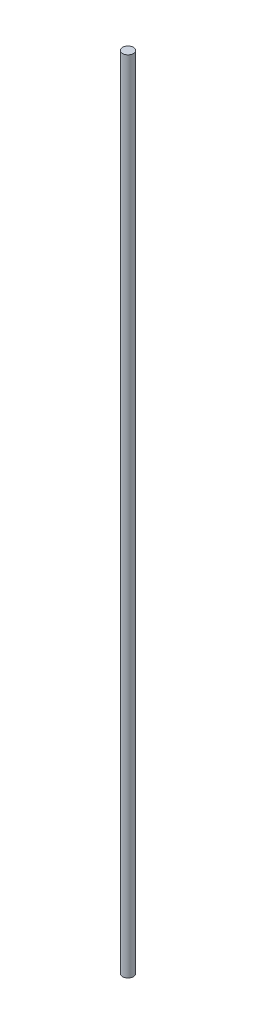
ISO-10303-21;
HEADER;
FILE_DESCRIPTION(('STEP AP214'),'2;1');
FILE_NAME('part.step','',(''),(''),'','','');
FILE_SCHEMA(('AUTOMOTIVE_DESIGN { 1 0 10303 214 1 1 1 1 }'));
ENDSEC;
DATA;
#1=APPLICATION_CONTEXT('core data for automotive mechanical design processes');
#2=APPLICATION_PROTOCOL_DEFINITION('international standard','automotive_design',2000,#1);
#3=PRODUCT_CONTEXT('',#1,'mechanical');
#4=PRODUCT('Part','Part','',(#3));
#5=PRODUCT_RELATED_PRODUCT_CATEGORY('part','',(#4));
#6=PRODUCT_DEFINITION_FORMATION('','',#4);
#7=PRODUCT_DEFINITION_CONTEXT('part definition',#1,'design');
#8=PRODUCT_DEFINITION('design','',#6,#7);
#9=PRODUCT_DEFINITION_SHAPE('','',#8);
#10=(LENGTH_UNIT() NAMED_UNIT(*) SI_UNIT(.MILLI.,.METRE.));
#11=(NAMED_UNIT(*) PLANE_ANGLE_UNIT() SI_UNIT($,.RADIAN.));
#12=(NAMED_UNIT(*) SI_UNIT($,.STERADIAN.) SOLID_ANGLE_UNIT());
#13=UNCERTAINTY_MEASURE_WITH_UNIT(LENGTH_MEASURE(1.E-05),#10,'distance_accuracy_value','');
#14=(GEOMETRIC_REPRESENTATION_CONTEXT(3) GLOBAL_UNCERTAINTY_ASSIGNED_CONTEXT((#13)) GLOBAL_UNIT_ASSIGNED_CONTEXT((#10,
#11,#12)) REPRESENTATION_CONTEXT('',''));
#15=CARTESIAN_POINT('',(0.,0.,0.));
#16=DIRECTION('',(0.,0.,1.));
#17=DIRECTION('',(1.,0.,0.));
#18=AXIS2_PLACEMENT_3D('',#15,#16,#17);
#19=CARTESIAN_POINT('',(0.,935.5,0.));
#20=DIRECTION('',(0.,-1.,0.));
#21=DIRECTION('',(0.,0.,-1.));
#22=AXIS2_PLACEMENT_3D('',#19,#20,#21);
#23=CYLINDRICAL_SURFACE('',#22,6.35);
#24=CARTESIAN_POINT('',(0.,935.5,0.));
#25=DIRECTION('',(0.,1.,0.));
#26=DIRECTION('',(0.,0.,1.));
#27=AXIS2_PLACEMENT_3D('',#24,#25,#26);
#28=CIRCLE('',#27,6.35);
#29=CARTESIAN_POINT('',(0.,935.5,-6.35));
#30=VERTEX_POINT('',#29);
#31=EDGE_CURVE('E10',#30,#30,#28,.T.);
#32=CARTESIAN_POINT('',(0.,0.,0.));
#33=DIRECTION('',(0.,1.,0.));
#34=DIRECTION('',(0.,0.,1.));
#35=AXIS2_PLACEMENT_3D('',#32,#33,#34);
#36=CIRCLE('',#35,6.35);
#37=CARTESIAN_POINT('',(0.,-1.11022302462516E-13,-6.35));
#38=VERTEX_POINT('',#37);
#39=EDGE_CURVE('E33',#38,#38,#36,.T.);
#40=CARTESIAN_POINT('',(0.,935.5,-6.35));
#41=CARTESIAN_POINT('',(0.,925.755208333333,-6.35));
#42=CARTESIAN_POINT('',(0.,916.010416666667,-6.35));
#43=CARTESIAN_POINT('',(0.,896.520833333333,-6.35));
#44=CARTESIAN_POINT('',(0.,886.776041666667,-6.35));
#45=CARTESIAN_POINT('',(0.,867.286458333333,-6.35));
#46=CARTESIAN_POINT('',(0.,857.541666666667,-6.35));
#47=CARTESIAN_POINT('',(0.,838.052083333333,-6.35));
#48=CARTESIAN_POINT('',(0.,828.307291666667,-6.35));
#49=CARTESIAN_POINT('',(0.,808.817708333333,-6.35));
#50=CARTESIAN_POINT('',(0.,799.072916666667,-6.35));
#51=CARTESIAN_POINT('',(0.,779.583333333333,-6.35));
#52=CARTESIAN_POINT('',(0.,769.838541666667,-6.35));
#53=CARTESIAN_POINT('',(0.,750.348958333333,-6.35));
#54=CARTESIAN_POINT('',(0.,740.604166666667,-6.35));
#55=CARTESIAN_POINT('',(0.,721.114583333333,-6.35));
#56=CARTESIAN_POINT('',(0.,711.369791666667,-6.35));
#57=CARTESIAN_POINT('',(0.,691.880208333333,-6.35));
#58=CARTESIAN_POINT('',(0.,682.135416666667,-6.35));
#59=CARTESIAN_POINT('',(0.,662.645833333333,-6.35));
#60=CARTESIAN_POINT('',(0.,652.901041666667,-6.35));
#61=CARTESIAN_POINT('',(0.,633.411458333333,-6.35));
#62=CARTESIAN_POINT('',(0.,623.666666666667,-6.35));
#63=CARTESIAN_POINT('',(0.,604.177083333333,-6.35));
#64=CARTESIAN_POINT('',(0.,594.432291666667,-6.35));
#65=CARTESIAN_POINT('',(0.,574.942708333333,-6.35));
#66=CARTESIAN_POINT('',(0.,565.197916666667,-6.35));
#67=CARTESIAN_POINT('',(0.,545.708333333333,-6.35));
#68=CARTESIAN_POINT('',(0.,535.963541666667,-6.35));
#69=CARTESIAN_POINT('',(0.,516.473958333333,-6.35));
#70=CARTESIAN_POINT('',(0.,506.729166666667,-6.35));
#71=CARTESIAN_POINT('',(0.,487.239583333333,-6.35));
#72=CARTESIAN_POINT('',(0.,477.494791666667,-6.35));
#73=CARTESIAN_POINT('',(0.,458.005208333333,-6.35));
#74=CARTESIAN_POINT('',(0.,448.260416666667,-6.35));
#75=CARTESIAN_POINT('',(0.,428.770833333333,-6.35));
#76=CARTESIAN_POINT('',(0.,419.026041666667,-6.35));
#77=CARTESIAN_POINT('',(0.,399.536458333333,-6.35));
#78=CARTESIAN_POINT('',(0.,389.791666666667,-6.35));
#79=CARTESIAN_POINT('',(0.,370.302083333333,-6.35));
#80=CARTESIAN_POINT('',(0.,360.557291666667,-6.35));
#81=CARTESIAN_POINT('',(0.,341.067708333333,-6.35));
#82=CARTESIAN_POINT('',(0.,331.322916666667,-6.35));
#83=CARTESIAN_POINT('',(0.,311.833333333333,-6.35));
#84=CARTESIAN_POINT('',(0.,302.088541666667,-6.35));
#85=CARTESIAN_POINT('',(0.,282.598958333333,-6.35));
#86=CARTESIAN_POINT('',(0.,272.854166666667,-6.35));
#87=CARTESIAN_POINT('',(0.,253.364583333333,-6.35));
#88=CARTESIAN_POINT('',(0.,243.619791666667,-6.35));
#89=CARTESIAN_POINT('',(0.,224.130208333333,-6.35));
#90=CARTESIAN_POINT('',(0.,214.385416666667,-6.35));
#91=CARTESIAN_POINT('',(0.,194.895833333333,-6.35));
#92=CARTESIAN_POINT('',(0.,185.151041666667,-6.35));
#93=CARTESIAN_POINT('',(0.,165.661458333333,-6.35));
#94=CARTESIAN_POINT('',(0.,155.916666666667,-6.35));
#95=CARTESIAN_POINT('',(0.,136.427083333333,-6.35));
#96=CARTESIAN_POINT('',(0.,126.682291666667,-6.35));
#97=CARTESIAN_POINT('',(0.,107.192708333333,-6.35));
#98=CARTESIAN_POINT('',(0.,97.4479166666666,-6.35));
#99=CARTESIAN_POINT('',(0.,77.9583333333332,-6.35));
#100=CARTESIAN_POINT('',(0.,68.2135416666665,-6.35));
#101=CARTESIAN_POINT('',(0.,48.7239583333332,-6.35));
#102=CARTESIAN_POINT('',(0.,38.9791666666666,-6.35));
#103=CARTESIAN_POINT('',(0.,19.4895833333332,-6.35));
#104=CARTESIAN_POINT('',(0.,9.74479166666657,-6.35));
#105=CARTESIAN_POINT('',(0.,-1.11022302462516E-13,-6.35));
#106=B_SPLINE_CURVE_WITH_KNOTS('',3,(#40,#41,#42,#43,#44,#45,#46,#47,#48,#49,#50,#51,#52,#53,
#54,#55,#56,#57,#58,#59,#60,#61,#62,#63,#64,#65,#66,#67,#68,#69,#70,#71,#72,#73,#74,#75,#76,#77,
#78,#79,#80,#81,#82,#83,#84,#85,#86,#87,#88,#89,#90,#91,#92,#93,#94,#95,#96,#97,#98,#99,#100,
#101,#102,#103,#104,#105),.UNSPECIFIED.,.F.,.F.,(4,2,2,2,2,2,2,2,2,2,2,2,2,2,2,2,2,2,2,2,2,2,2,
2,2,2,2,2,2,2,2,2,4),(0.,29.2343749999999,58.46875,87.7031249999999,116.9375,146.171875,
175.40625,204.640625,233.875,263.109375,292.34375,321.578125,350.8125,380.046875,409.28125,
438.515625,467.75,496.984375,526.21875,555.453125,584.6875,613.921875,643.15625,672.390625,
701.625,730.859375,760.09375,789.328125,818.5625,847.796875,877.03125,906.265625,935.5),.UNSPECIFIED.);
#107=EDGE_CURVE('BSEAM30',#30,#38,#106,.T.);
#108=ORIENTED_EDGE('',*,*,#31,.F.);
#109=ORIENTED_EDGE('',*,*,#39,.T.);
#110=ORIENTED_EDGE('',*,*,#107,.T.);
#111=ORIENTED_EDGE('',*,*,#107,.F.);
#112=EDGE_LOOP('',(#108,#110,#109,#111));
#113=FACE_BOUND('',#112,.T.);
#114=ADVANCED_FACE('F30',(#113),#23,.T.);
#115=CARTESIAN_POINT('',(0.,935.5,0.));
#116=DIRECTION('',(0.,1.,0.));
#117=DIRECTION('',(0.,0.,1.));
#118=AXIS2_PLACEMENT_3D('',#115,#116,#117);
#119=PLANE('',#118);
#120=ORIENTED_EDGE('',*,*,#31,.T.);
#121=EDGE_LOOP('',(#120));
#122=FACE_BOUND('',#121,.T.);
#123=ADVANCED_FACE('F45',(#122),#119,.T.);
#124=CARTESIAN_POINT('',(0.,0.,0.));
#125=DIRECTION('',(0.,1.,0.));
#126=DIRECTION('',(0.,0.,1.));
#127=AXIS2_PLACEMENT_3D('',#124,#125,#126);
#128=PLANE('',#127);
#129=ORIENTED_EDGE('',*,*,#39,.F.);
#130=EDGE_LOOP('',(#129));
#131=FACE_BOUND('',#130,.T.);
#132=ADVANCED_FACE('F43',(#131),#128,.F.);
#133=CLOSED_SHELL('',(#114,#123,#132));
#134=MANIFOLD_SOLID_BREP('B2',#133);
#135=ADVANCED_BREP_SHAPE_REPRESENTATION('',(#18,#134),#14);
#136=SHAPE_DEFINITION_REPRESENTATION(#9,#135);
ENDSEC;
END-ISO-10303-21;
